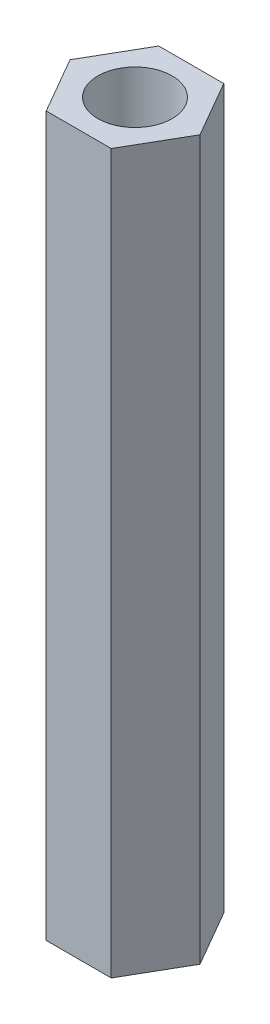
ISO-10303-21;
HEADER;
FILE_DESCRIPTION(('STEP AP214'),'2;1');
FILE_NAME('part.step','',(''),(''),'','','');
FILE_SCHEMA(('AUTOMOTIVE_DESIGN { 1 0 10303 214 1 1 1 1 }'));
ENDSEC;
DATA;
#1=APPLICATION_CONTEXT('core data for automotive mechanical design processes');
#2=APPLICATION_PROTOCOL_DEFINITION('international standard','automotive_design',2000,#1);
#3=PRODUCT_CONTEXT('',#1,'mechanical');
#4=PRODUCT('Part','Part','',(#3));
#5=PRODUCT_RELATED_PRODUCT_CATEGORY('part','',(#4));
#6=PRODUCT_DEFINITION_FORMATION('','',#4);
#7=PRODUCT_DEFINITION_CONTEXT('part definition',#1,'design');
#8=PRODUCT_DEFINITION('design','',#6,#7);
#9=PRODUCT_DEFINITION_SHAPE('','',#8);
#10=(LENGTH_UNIT() NAMED_UNIT(*) SI_UNIT(.MILLI.,.METRE.));
#11=(NAMED_UNIT(*) PLANE_ANGLE_UNIT() SI_UNIT($,.RADIAN.));
#12=(NAMED_UNIT(*) SI_UNIT($,.STERADIAN.) SOLID_ANGLE_UNIT());
#13=UNCERTAINTY_MEASURE_WITH_UNIT(LENGTH_MEASURE(1.E-05),#10,'distance_accuracy_value','');
#14=(GEOMETRIC_REPRESENTATION_CONTEXT(3) GLOBAL_UNCERTAINTY_ASSIGNED_CONTEXT((#13)) GLOBAL_UNIT_ASSIGNED_CONTEXT((#10,
#11,#12)) REPRESENTATION_CONTEXT('',''));
#15=CARTESIAN_POINT('',(0.,0.,0.));
#16=DIRECTION('',(0.,0.,1.));
#17=DIRECTION('',(1.,0.,0.));
#18=AXIS2_PLACEMENT_3D('',#15,#16,#17);
#19=CARTESIAN_POINT('',(0.,30.,0.));
#20=DIRECTION('',(0.,1.,0.));
#21=DIRECTION('',(0.,0.,1.));
#22=AXIS2_PLACEMENT_3D('',#19,#20,#21);
#23=PLANE('',#22);
#24=DIRECTION('',(0.5,0.,-0.866025403784439));
#25=VECTOR('',#24,1.);
#26=CARTESIAN_POINT('',(1.35677313259562,30.,2.35));
#27=LINE('',#26,#25);
#28=CARTESIAN_POINT('',(1.35677313259562,30.,2.35));
#29=VERTEX_POINT('',#28);
#30=CARTESIAN_POINT('',(2.71354626519124,30.,0.));
#31=VERTEX_POINT('',#30);
#32=EDGE_CURVE('E129',#29,#31,#27,.T.);
#33=ORIENTED_EDGE('',*,*,#32,.T.);
#34=DIRECTION('',(-0.5,0.,-0.866025403784438));
#35=VECTOR('',#34,1.);
#36=CARTESIAN_POINT('',(2.71354626519124,30.,0.));
#37=LINE('',#36,#35);
#38=CARTESIAN_POINT('',(1.35677313259562,30.,-2.35));
#39=VERTEX_POINT('',#38);
#40=EDGE_CURVE('E87',#31,#39,#37,.T.);
#41=ORIENTED_EDGE('',*,*,#40,.T.);
#42=DIRECTION('',(-1.,0.,0.));
#43=VECTOR('',#42,1.);
#44=CARTESIAN_POINT('',(1.35677313259562,30.,-2.35));
#45=LINE('',#44,#43);
#46=CARTESIAN_POINT('',(-1.35677313259562,30.,-2.35));
#47=VERTEX_POINT('',#46);
#48=EDGE_CURVE('E100',#39,#47,#45,.T.);
#49=ORIENTED_EDGE('',*,*,#48,.T.);
#50=DIRECTION('',(-0.5,0.,0.866025403784439));
#51=VECTOR('',#50,1.);
#52=CARTESIAN_POINT('',(-1.35677313259562,30.,-2.35));
#53=LINE('',#52,#51);
#54=CARTESIAN_POINT('',(-2.71354626519124,30.,0.));
#55=VERTEX_POINT('',#54);
#56=EDGE_CURVE('E94',#47,#55,#53,.T.);
#57=ORIENTED_EDGE('',*,*,#56,.T.);
#58=DIRECTION('',(0.5,0.,0.866025403784438));
#59=VECTOR('',#58,1.);
#60=CARTESIAN_POINT('',(-2.71354626519124,30.,0.));
#61=LINE('',#60,#59);
#62=CARTESIAN_POINT('',(-1.35677313259562,30.,2.35));
#63=VERTEX_POINT('',#62);
#64=EDGE_CURVE('E98',#55,#63,#61,.T.);
#65=ORIENTED_EDGE('',*,*,#64,.T.);
#66=DIRECTION('',(1.,0.,0.));
#67=VECTOR('',#66,1.);
#68=CARTESIAN_POINT('',(-1.35677313259562,30.,2.35));
#69=LINE('',#68,#67);
#70=EDGE_CURVE('E50',#63,#29,#69,.T.);
#71=ORIENTED_EDGE('',*,*,#70,.T.);
#72=EDGE_LOOP('',(#33,#41,#49,#57,#65,#71));
#73=FACE_BOUND('',#72,.T.);
#74=CARTESIAN_POINT('',(0.,30.,0.));
#75=DIRECTION('',(0.,1.,0.));
#76=DIRECTION('',(0.,0.,1.));
#77=AXIS2_PLACEMENT_3D('',#74,#75,#76);
#78=CIRCLE('',#77,1.55);
#79=CARTESIAN_POINT('',(0.,30.,1.55));
#80=VERTEX_POINT('',#79);
#81=EDGE_CURVE('E122',#80,#80,#78,.T.);
#82=ORIENTED_EDGE('',*,*,#81,.F.);
#83=EDGE_LOOP('',(#82));
#84=FACE_BOUND('',#83,.T.);
#85=ADVANCED_FACE('F33',(#73,#84),#23,.T.);
#86=CARTESIAN_POINT('',(0.,0.,0.));
#87=DIRECTION('',(0.,1.,0.));
#88=DIRECTION('',(0.,0.,1.));
#89=AXIS2_PLACEMENT_3D('',#86,#87,#88);
#90=PLANE('',#89);
#91=DIRECTION('',(0.5,0.,-0.866025403784439));
#92=VECTOR('',#91,1.);
#93=CARTESIAN_POINT('',(1.35677313259562,0.,2.35));
#94=LINE('',#93,#92);
#95=CARTESIAN_POINT('',(1.35677313259562,0.,2.35));
#96=VERTEX_POINT('',#95);
#97=CARTESIAN_POINT('',(2.71354626519124,0.,0.));
#98=VERTEX_POINT('',#97);
#99=EDGE_CURVE('E118',#96,#98,#94,.T.);
#100=ORIENTED_EDGE('',*,*,#99,.F.);
#101=DIRECTION('',(1.,0.,0.));
#102=VECTOR('',#101,1.);
#103=CARTESIAN_POINT('',(-1.35677313259562,0.,2.35));
#104=LINE('',#103,#102);
#105=CARTESIAN_POINT('',(-1.35677313259562,0.,2.35));
#106=VERTEX_POINT('',#105);
#107=EDGE_CURVE('E79',#106,#96,#104,.T.);
#108=ORIENTED_EDGE('',*,*,#107,.F.);
#109=DIRECTION('',(0.5,0.,0.866025403784438));
#110=VECTOR('',#109,1.);
#111=CARTESIAN_POINT('',(-2.71354626519124,0.,0.));
#112=LINE('',#111,#110);
#113=CARTESIAN_POINT('',(-2.71354626519124,0.,0.));
#114=VERTEX_POINT('',#113);
#115=EDGE_CURVE('E73',#114,#106,#112,.T.);
#116=ORIENTED_EDGE('',*,*,#115,.F.);
#117=DIRECTION('',(-0.5,0.,0.866025403784439));
#118=VECTOR('',#117,1.);
#119=CARTESIAN_POINT('',(-1.35677313259562,0.,-2.35));
#120=LINE('',#119,#118);
#121=CARTESIAN_POINT('',(-1.35677313259562,0.,-2.35));
#122=VERTEX_POINT('',#121);
#123=EDGE_CURVE('E108',#122,#114,#120,.T.);
#124=ORIENTED_EDGE('',*,*,#123,.F.);
#125=DIRECTION('',(-1.,0.,0.));
#126=VECTOR('',#125,1.);
#127=CARTESIAN_POINT('',(1.35677313259562,0.,-2.35));
#128=LINE('',#127,#126);
#129=CARTESIAN_POINT('',(1.35677313259562,0.,-2.35));
#130=VERTEX_POINT('',#129);
#131=EDGE_CURVE('E124',#130,#122,#128,.T.);
#132=ORIENTED_EDGE('',*,*,#131,.F.);
#133=DIRECTION('',(-0.5,0.,-0.866025403784438));
#134=VECTOR('',#133,1.);
#135=CARTESIAN_POINT('',(2.71354626519124,0.,0.));
#136=LINE('',#135,#134);
#137=EDGE_CURVE('E121',#98,#130,#136,.T.);
#138=ORIENTED_EDGE('',*,*,#137,.F.);
#139=EDGE_LOOP('',(#100,#108,#116,#124,#132,#138));
#140=FACE_BOUND('',#139,.T.);
#141=CARTESIAN_POINT('',(0.,0.,0.));
#142=DIRECTION('',(0.,1.,0.));
#143=DIRECTION('',(0.,0.,1.));
#144=AXIS2_PLACEMENT_3D('',#141,#142,#143);
#145=CIRCLE('',#144,1.55);
#146=CARTESIAN_POINT('',(0.,0.,1.55));
#147=VERTEX_POINT('',#146);
#148=EDGE_CURVE('E222',#147,#147,#145,.T.);
#149=ORIENTED_EDGE('',*,*,#148,.T.);
#150=EDGE_LOOP('',(#149));
#151=FACE_BOUND('',#150,.T.);
#152=ADVANCED_FACE('F138',(#140,#151),#90,.F.);
#153=CARTESIAN_POINT('',(1.35677313259562,30.,2.35));
#154=DIRECTION('',(-0.866025403784439,0.,-0.5));
#155=DIRECTION('',(-0.5,0.,0.866025403784439));
#156=AXIS2_PLACEMENT_3D('',#153,#154,#155);
#157=PLANE('',#156);
#158=ORIENTED_EDGE('',*,*,#99,.T.);
#159=DIRECTION('',(0.,-1.,0.));
#160=VECTOR('',#159,1.);
#161=CARTESIAN_POINT('',(2.71354626519124,30.,0.));
#162=LINE('',#161,#160);
#163=EDGE_CURVE('E11',#31,#98,#162,.T.);
#164=ORIENTED_EDGE('',*,*,#163,.F.);
#165=ORIENTED_EDGE('',*,*,#32,.F.);
#166=DIRECTION('',(0.,-1.,0.));
#167=VECTOR('',#166,1.);
#168=CARTESIAN_POINT('',(1.35677313259562,30.,2.35));
#169=LINE('',#168,#167);
#170=EDGE_CURVE('E114',#29,#96,#169,.T.);
#171=ORIENTED_EDGE('',*,*,#170,.T.);
#172=EDGE_LOOP('',(#158,#164,#165,#171));
#173=FACE_BOUND('',#172,.T.);
#174=ADVANCED_FACE('F35',(#173),#157,.F.);
#175=CARTESIAN_POINT('',(2.71354626519124,30.,0.));
#176=DIRECTION('',(-0.866025403784438,0.,0.5));
#177=DIRECTION('',(0.5,0.,0.866025403784438));
#178=AXIS2_PLACEMENT_3D('',#175,#176,#177);
#179=PLANE('',#178);
#180=ORIENTED_EDGE('',*,*,#137,.T.);
#181=DIRECTION('',(0.,-1.,0.));
#182=VECTOR('',#181,1.);
#183=CARTESIAN_POINT('',(1.35677313259562,30.,-2.35));
#184=LINE('',#183,#182);
#185=EDGE_CURVE('E42',#39,#130,#184,.T.);
#186=ORIENTED_EDGE('',*,*,#185,.F.);
#187=ORIENTED_EDGE('',*,*,#40,.F.);
#188=ORIENTED_EDGE('',*,*,#163,.T.);
#189=EDGE_LOOP('',(#180,#186,#187,#188));
#190=FACE_BOUND('',#189,.T.);
#191=ADVANCED_FACE('F163',(#190),#179,.F.);
#192=CARTESIAN_POINT('',(1.35677313259562,30.,-2.35));
#193=DIRECTION('',(0.,0.,1.));
#194=DIRECTION('',(1.,0.,0.));
#195=AXIS2_PLACEMENT_3D('',#192,#193,#194);
#196=PLANE('',#195);
#197=ORIENTED_EDGE('',*,*,#131,.T.);
#198=DIRECTION('',(0.,-1.,0.));
#199=VECTOR('',#198,1.);
#200=CARTESIAN_POINT('',(-1.35677313259562,30.,-2.35));
#201=LINE('',#200,#199);
#202=EDGE_CURVE('E109',#47,#122,#201,.T.);
#203=ORIENTED_EDGE('',*,*,#202,.F.);
#204=ORIENTED_EDGE('',*,*,#48,.F.);
#205=ORIENTED_EDGE('',*,*,#185,.T.);
#206=EDGE_LOOP('',(#197,#203,#204,#205));
#207=FACE_BOUND('',#206,.T.);
#208=ADVANCED_FACE('F135',(#207),#196,.F.);
#209=CARTESIAN_POINT('',(-1.35677313259562,30.,-2.35));
#210=DIRECTION('',(0.866025403784439,0.,0.5));
#211=DIRECTION('',(0.5,0.,-0.866025403784439));
#212=AXIS2_PLACEMENT_3D('',#209,#210,#211);
#213=PLANE('',#212);
#214=ORIENTED_EDGE('',*,*,#123,.T.);
#215=DIRECTION('',(0.,-1.,0.));
#216=VECTOR('',#215,1.);
#217=CARTESIAN_POINT('',(-2.71354626519124,30.,0.));
#218=LINE('',#217,#216);
#219=EDGE_CURVE('E105',#55,#114,#218,.T.);
#220=ORIENTED_EDGE('',*,*,#219,.F.);
#221=ORIENTED_EDGE('',*,*,#56,.F.);
#222=ORIENTED_EDGE('',*,*,#202,.T.);
#223=EDGE_LOOP('',(#214,#220,#221,#222));
#224=FACE_BOUND('',#223,.T.);
#225=ADVANCED_FACE('F106',(#224),#213,.F.);
#226=CARTESIAN_POINT('',(-2.71354626519124,30.,0.));
#227=DIRECTION('',(0.866025403784438,0.,-0.5));
#228=DIRECTION('',(-0.5,0.,-0.866025403784439));
#229=AXIS2_PLACEMENT_3D('',#226,#227,#228);
#230=PLANE('',#229);
#231=ORIENTED_EDGE('',*,*,#115,.T.);
#232=DIRECTION('',(0.,-1.,0.));
#233=VECTOR('',#232,1.);
#234=CARTESIAN_POINT('',(-1.35677313259562,30.,2.35));
#235=LINE('',#234,#233);
#236=EDGE_CURVE('E110',#63,#106,#235,.T.);
#237=ORIENTED_EDGE('',*,*,#236,.F.);
#238=ORIENTED_EDGE('',*,*,#64,.F.);
#239=ORIENTED_EDGE('',*,*,#219,.T.);
#240=EDGE_LOOP('',(#231,#237,#238,#239));
#241=FACE_BOUND('',#240,.T.);
#242=ADVANCED_FACE('F112',(#241),#230,.F.);
#243=CARTESIAN_POINT('',(-1.35677313259562,30.,2.35));
#244=DIRECTION('',(0.,0.,-1.));
#245=DIRECTION('',(-1.,0.,0.));
#246=AXIS2_PLACEMENT_3D('',#243,#244,#245);
#247=PLANE('',#246);
#248=ORIENTED_EDGE('',*,*,#107,.T.);
#249=ORIENTED_EDGE('',*,*,#170,.F.);
#250=ORIENTED_EDGE('',*,*,#70,.F.);
#251=ORIENTED_EDGE('',*,*,#236,.T.);
#252=EDGE_LOOP('',(#248,#249,#250,#251));
#253=FACE_BOUND('',#252,.T.);
#254=ADVANCED_FACE('F143',(#253),#247,.F.);
#255=CARTESIAN_POINT('',(0.,30.,0.));
#256=DIRECTION('',(0.,-1.,0.));
#257=DIRECTION('',(0.,0.,-1.));
#258=AXIS2_PLACEMENT_3D('',#255,#256,#257);
#259=CYLINDRICAL_SURFACE('',#258,1.55);
#260=ORIENTED_EDGE('',*,*,#81,.T.);
#261=EDGE_LOOP('',(#260));
#262=FACE_BOUND('',#261,.T.);
#263=ORIENTED_EDGE('',*,*,#148,.F.);
#264=EDGE_LOOP('',(#263));
#265=FACE_BOUND('',#264,.T.);
#266=ADVANCED_FACE('F145',(#262,#265),#259,.F.);
#267=CLOSED_SHELL('',(#85,#152,#174,#191,#208,#225,#242,#254,#266));
#268=MANIFOLD_SOLID_BREP('B2',#267);
#269=ADVANCED_BREP_SHAPE_REPRESENTATION('',(#18,#268),#14);
#270=SHAPE_DEFINITION_REPRESENTATION(#9,#269);
ENDSEC;
END-ISO-10303-21;
